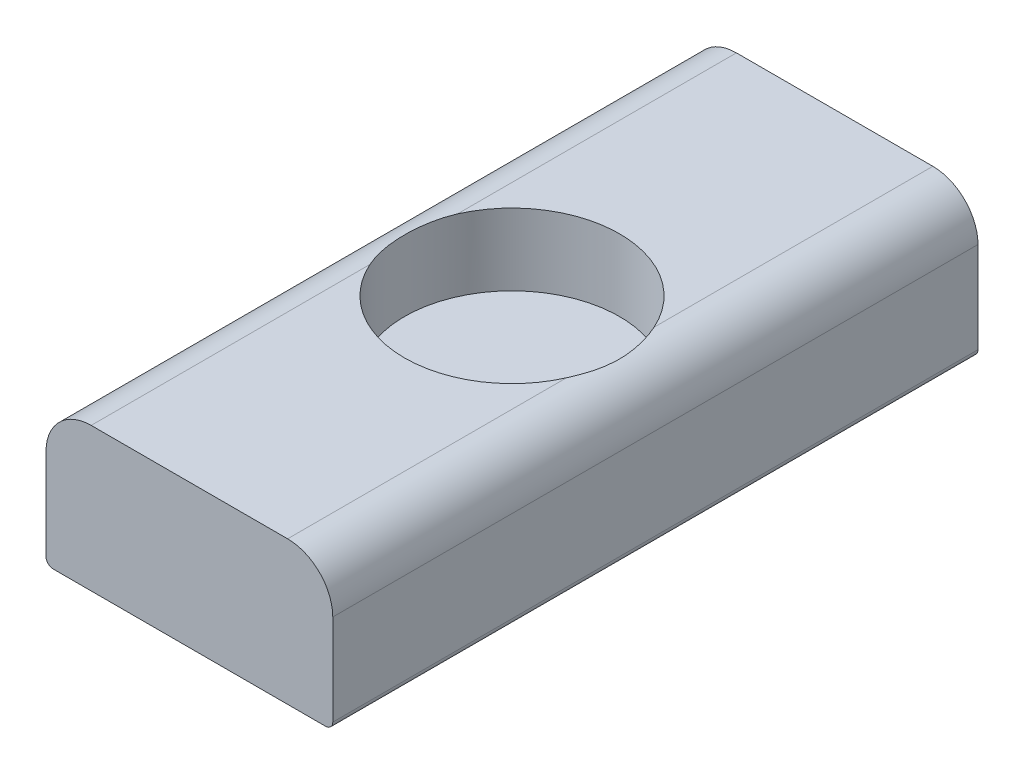
ISO-10303-21;
HEADER;
FILE_DESCRIPTION(('STEP AP214'),'2;1');
FILE_NAME('part.step','',(''),(''),'','','');
FILE_SCHEMA(('AUTOMOTIVE_DESIGN { 1 0 10303 214 1 1 1 1 }'));
ENDSEC;
DATA;
#1=APPLICATION_CONTEXT('core data for automotive mechanical design processes');
#2=APPLICATION_PROTOCOL_DEFINITION('international standard','automotive_design',2000,#1);
#3=PRODUCT_CONTEXT('',#1,'mechanical');
#4=PRODUCT('Part','Part','',(#3));
#5=PRODUCT_RELATED_PRODUCT_CATEGORY('part','',(#4));
#6=PRODUCT_DEFINITION_FORMATION('','',#4);
#7=PRODUCT_DEFINITION_CONTEXT('part definition',#1,'design');
#8=PRODUCT_DEFINITION('design','',#6,#7);
#9=PRODUCT_DEFINITION_SHAPE('','',#8);
#10=(LENGTH_UNIT() NAMED_UNIT(*) SI_UNIT(.MILLI.,.METRE.));
#11=(NAMED_UNIT(*) PLANE_ANGLE_UNIT() SI_UNIT($,.RADIAN.));
#12=(NAMED_UNIT(*) SI_UNIT($,.STERADIAN.) SOLID_ANGLE_UNIT());
#13=UNCERTAINTY_MEASURE_WITH_UNIT(LENGTH_MEASURE(1.E-05),#10,'distance_accuracy_value','');
#14=(GEOMETRIC_REPRESENTATION_CONTEXT(3) GLOBAL_UNCERTAINTY_ASSIGNED_CONTEXT((#13)) GLOBAL_UNIT_ASSIGNED_CONTEXT((#10,
#11,#12)) REPRESENTATION_CONTEXT('',''));
#15=CARTESIAN_POINT('',(0.,0.,0.));
#16=DIRECTION('',(0.,0.,1.));
#17=DIRECTION('',(1.,0.,0.));
#18=AXIS2_PLACEMENT_3D('',#15,#16,#17);
#19=CARTESIAN_POINT('',(-20.,10.,90.));
#20=DIRECTION('',(0.,-1.,0.));
#21=DIRECTION('',(0.,0.,-1.));
#22=AXIS2_PLACEMENT_3D('',#19,#20,#21);
#23=PLANE('',#22);
#24=DIRECTION('',(-1.,0.,0.));
#25=VECTOR('',#24,1.);
#26=CARTESIAN_POINT('',(-20.,10.,90.));
#27=LINE('',#26,#25);
#28=CARTESIAN_POINT('',(13.7,10.,90.));
#29=VERTEX_POINT('',#28);
#30=CARTESIAN_POINT('',(-13.7,10.,90.));
#31=VERTEX_POINT('',#30);
#32=EDGE_CURVE('E143',#29,#31,#27,.T.);
#33=ORIENTED_EDGE('',*,*,#32,.F.);
#34=DIRECTION('',(0.,0.,-1.));
#35=VECTOR('',#34,1.);
#36=CARTESIAN_POINT('',(13.7,10.,90.));
#37=LINE('',#36,#35);
#38=CARTESIAN_POINT('',(13.7,10.,51.1081912216302));
#39=VERTEX_POINT('',#38);
#40=EDGE_CURVE('E165',#29,#39,#37,.T.);
#41=ORIENTED_EDGE('',*,*,#40,.T.);
#42=CARTESIAN_POINT('',(0.,10.,45.));
#43=DIRECTION('',(0.,1.,0.));
#44=DIRECTION('',(0.,0.,1.));
#45=AXIS2_PLACEMENT_3D('',#42,#43,#44);
#46=CIRCLE('',#45,15.);
#47=CARTESIAN_POINT('',(-13.7,10.,51.1081912216302));
#48=VERTEX_POINT('',#47);
#49=EDGE_CURVE('E253',#48,#39,#46,.T.);
#50=ORIENTED_EDGE('',*,*,#49,.F.);
#51=DIRECTION('',(0.,0.,-1.));
#52=VECTOR('',#51,1.);
#53=CARTESIAN_POINT('',(-13.7,10.,90.));
#54=LINE('',#53,#52);
#55=EDGE_CURVE('E159',#48,#31,#54,.F.);
#56=ORIENTED_EDGE('',*,*,#55,.T.);
#57=EDGE_LOOP('',(#33,#41,#50,#56));
#58=FACE_BOUND('',#57,.T.);
#59=ADVANCED_FACE('F33',(#58),#23,.F.);
#60=CARTESIAN_POINT('',(20.,-10.,90.));
#61=DIRECTION('',(-1.,0.,0.));
#62=DIRECTION('',(0.,0.,1.));
#63=AXIS2_PLACEMENT_3D('',#60,#61,#62);
#64=PLANE('',#63);
#65=DIRECTION('',(0.,1.,0.));
#66=VECTOR('',#65,1.);
#67=CARTESIAN_POINT('',(20.,-10.,0.));
#68=LINE('',#67,#66);
#69=CARTESIAN_POINT('',(20.,-9.,0.));
#70=VERTEX_POINT('',#69);
#71=CARTESIAN_POINT('',(20.,3.7,0.));
#72=VERTEX_POINT('',#71);
#73=EDGE_CURVE('E248',#70,#72,#68,.T.);
#74=ORIENTED_EDGE('',*,*,#73,.T.);
#75=DIRECTION('',(0.,0.,-1.));
#76=VECTOR('',#75,1.);
#77=CARTESIAN_POINT('',(20.,3.7,90.));
#78=LINE('',#77,#76);
#79=CARTESIAN_POINT('',(20.,3.7,90.));
#80=VERTEX_POINT('',#79);
#81=EDGE_CURVE('E57',#72,#80,#78,.F.);
#82=ORIENTED_EDGE('',*,*,#81,.T.);
#83=DIRECTION('',(0.,1.,0.));
#84=VECTOR('',#83,1.);
#85=CARTESIAN_POINT('',(20.,-10.,90.));
#86=LINE('',#85,#84);
#87=CARTESIAN_POINT('',(20.,-9.,90.));
#88=VERTEX_POINT('',#87);
#89=EDGE_CURVE('E140',#88,#80,#86,.T.);
#90=ORIENTED_EDGE('',*,*,#89,.F.);
#91=DIRECTION('',(0.,0.,-1.));
#92=VECTOR('',#91,1.);
#93=CARTESIAN_POINT('',(20.,-9.,90.));
#94=LINE('',#93,#92);
#95=EDGE_CURVE('E156',#88,#70,#94,.T.);
#96=ORIENTED_EDGE('',*,*,#95,.T.);
#97=EDGE_LOOP('',(#74,#82,#90,#96));
#98=FACE_BOUND('',#97,.T.);
#99=ADVANCED_FACE('F202',(#98),#64,.F.);
#100=CARTESIAN_POINT('',(13.7,10.,38.8918087783698));
#101=VERTEX_POINT('',#100);
#102=CARTESIAN_POINT('',(-13.7,10.,38.8918087783698));
#103=VERTEX_POINT('',#102);
#104=EDGE_CURVE('E254',#101,#103,#46,.T.);
#105=ORIENTED_EDGE('',*,*,#104,.F.);
#106=DIRECTION('',(0.,0.,-1.));
#107=VECTOR('',#106,1.);
#108=CARTESIAN_POINT('',(13.7,10.,90.));
#109=LINE('',#108,#107);
#110=CARTESIAN_POINT('',(13.7,10.,0.));
#111=VERTEX_POINT('',#110);
#112=EDGE_CURVE('E163',#101,#111,#109,.T.);
#113=ORIENTED_EDGE('',*,*,#112,.T.);
#114=DIRECTION('',(-1.,0.,0.));
#115=VECTOR('',#114,1.);
#116=CARTESIAN_POINT('',(-20.,10.,0.));
#117=LINE('',#116,#115);
#118=CARTESIAN_POINT('',(-13.7,10.,0.));
#119=VERTEX_POINT('',#118);
#120=EDGE_CURVE('E145',#111,#119,#117,.T.);
#121=ORIENTED_EDGE('',*,*,#120,.T.);
#122=DIRECTION('',(0.,0.,-1.));
#123=VECTOR('',#122,1.);
#124=CARTESIAN_POINT('',(-13.7,10.,90.));
#125=LINE('',#124,#123);
#126=EDGE_CURVE('E161',#119,#103,#125,.F.);
#127=ORIENTED_EDGE('',*,*,#126,.T.);
#128=EDGE_LOOP('',(#105,#113,#121,#127));
#129=FACE_BOUND('',#128,.T.);
#130=ADVANCED_FACE('F198',(#129),#23,.F.);
#131=CARTESIAN_POINT('',(-20.,-10.,90.));
#132=DIRECTION('',(1.,0.,0.));
#133=DIRECTION('',(0.,0.,-1.));
#134=AXIS2_PLACEMENT_3D('',#131,#132,#133);
#135=PLANE('',#134);
#136=DIRECTION('',(0.,-1.,0.));
#137=VECTOR('',#136,1.);
#138=CARTESIAN_POINT('',(-20.,-10.,90.));
#139=LINE('',#138,#137);
#140=CARTESIAN_POINT('',(-20.,3.7,90.));
#141=VERTEX_POINT('',#140);
#142=CARTESIAN_POINT('',(-20.,-9.,90.));
#143=VERTEX_POINT('',#142);
#144=EDGE_CURVE('E230',#141,#143,#139,.T.);
#145=ORIENTED_EDGE('',*,*,#144,.F.);
#146=DIRECTION('',(0.,0.,-1.));
#147=VECTOR('',#146,1.);
#148=CARTESIAN_POINT('',(-20.,3.7,90.));
#149=LINE('',#148,#147);
#150=CARTESIAN_POINT('',(-20.,3.7,0.));
#151=VERTEX_POINT('',#150);
#152=EDGE_CURVE('E11',#141,#151,#149,.T.);
#153=ORIENTED_EDGE('',*,*,#152,.T.);
#154=DIRECTION('',(0.,-1.,0.));
#155=VECTOR('',#154,1.);
#156=CARTESIAN_POINT('',(-20.,-10.,0.));
#157=LINE('',#156,#155);
#158=CARTESIAN_POINT('',(-20.,-9.,0.));
#159=VERTEX_POINT('',#158);
#160=EDGE_CURVE('E141',#151,#159,#157,.T.);
#161=ORIENTED_EDGE('',*,*,#160,.T.);
#162=DIRECTION('',(0.,0.,-1.));
#163=VECTOR('',#162,1.);
#164=CARTESIAN_POINT('',(-20.,-9.,90.));
#165=LINE('',#164,#163);
#166=EDGE_CURVE('E121',#159,#143,#165,.F.);
#167=ORIENTED_EDGE('',*,*,#166,.T.);
#168=EDGE_LOOP('',(#145,#153,#161,#167));
#169=FACE_BOUND('',#168,.T.);
#170=ADVANCED_FACE('F195',(#169),#135,.F.);
#171=CARTESIAN_POINT('',(-20.,-10.,90.));
#172=DIRECTION('',(0.,1.,0.));
#173=DIRECTION('',(0.,0.,1.));
#174=AXIS2_PLACEMENT_3D('',#171,#172,#173);
#175=PLANE('',#174);
#176=DIRECTION('',(1.,0.,0.));
#177=VECTOR('',#176,1.);
#178=CARTESIAN_POINT('',(-20.,-10.,90.));
#179=LINE('',#178,#177);
#180=CARTESIAN_POINT('',(-19.,-10.,90.));
#181=VERTEX_POINT('',#180);
#182=CARTESIAN_POINT('',(19.,-10.,90.));
#183=VERTEX_POINT('',#182);
#184=EDGE_CURVE('E134',#181,#183,#179,.T.);
#185=ORIENTED_EDGE('',*,*,#184,.F.);
#186=DIRECTION('',(0.,0.,-1.));
#187=VECTOR('',#186,1.);
#188=CARTESIAN_POINT('',(-19.,-10.,90.));
#189=LINE('',#188,#187);
#190=CARTESIAN_POINT('',(-19.,-10.,0.));
#191=VERTEX_POINT('',#190);
#192=EDGE_CURVE('E119',#181,#191,#189,.T.);
#193=ORIENTED_EDGE('',*,*,#192,.T.);
#194=DIRECTION('',(1.,0.,0.));
#195=VECTOR('',#194,1.);
#196=CARTESIAN_POINT('',(-20.,-10.,0.));
#197=LINE('',#196,#195);
#198=CARTESIAN_POINT('',(19.,-10.,0.));
#199=VERTEX_POINT('',#198);
#200=EDGE_CURVE('E131',#191,#199,#197,.T.);
#201=ORIENTED_EDGE('',*,*,#200,.T.);
#202=DIRECTION('',(0.,0.,-1.));
#203=VECTOR('',#202,1.);
#204=CARTESIAN_POINT('',(19.,-10.,90.));
#205=LINE('',#204,#203);
#206=EDGE_CURVE('E135',#199,#183,#205,.F.);
#207=ORIENTED_EDGE('',*,*,#206,.T.);
#208=EDGE_LOOP('',(#185,#193,#201,#207));
#209=FACE_BOUND('',#208,.T.);
#210=ADVANCED_FACE('F130',(#209),#175,.F.);
#211=CARTESIAN_POINT('',(0.,0.,90.));
#212=DIRECTION('',(0.,0.,-1.));
#213=DIRECTION('',(-1.,0.,0.));
#214=AXIS2_PLACEMENT_3D('',#211,#212,#213);
#215=PLANE('',#214);
#216=ORIENTED_EDGE('',*,*,#89,.T.);
#217=CARTESIAN_POINT('',(13.7,3.7,90.));
#218=DIRECTION('',(0.,0.,-1.));
#219=DIRECTION('',(-1.,0.,0.));
#220=AXIS2_PLACEMENT_3D('',#217,#218,#219);
#221=CIRCLE('',#220,6.3);
#222=EDGE_CURVE('E42',#80,#29,#221,.F.);
#223=ORIENTED_EDGE('',*,*,#222,.T.);
#224=ORIENTED_EDGE('',*,*,#32,.T.);
#225=CARTESIAN_POINT('',(-13.7,3.7,90.));
#226=DIRECTION('',(0.,0.,-1.));
#227=DIRECTION('',(-1.,0.,0.));
#228=AXIS2_PLACEMENT_3D('',#225,#226,#227);
#229=CIRCLE('',#228,6.3);
#230=EDGE_CURVE('E49',#31,#141,#229,.F.);
#231=ORIENTED_EDGE('',*,*,#230,.T.);
#232=ORIENTED_EDGE('',*,*,#144,.T.);
#233=CARTESIAN_POINT('',(-19.,-9.,90.));
#234=DIRECTION('',(0.,0.,-1.));
#235=DIRECTION('',(-1.,0.,0.));
#236=AXIS2_PLACEMENT_3D('',#233,#234,#235);
#237=CIRCLE('',#236,1.);
#238=EDGE_CURVE('E154',#143,#181,#237,.F.);
#239=ORIENTED_EDGE('',*,*,#238,.T.);
#240=ORIENTED_EDGE('',*,*,#184,.T.);
#241=CARTESIAN_POINT('',(19.,-9.,90.));
#242=DIRECTION('',(0.,0.,-1.));
#243=DIRECTION('',(-1.,0.,0.));
#244=AXIS2_PLACEMENT_3D('',#241,#242,#243);
#245=CIRCLE('',#244,1.);
#246=EDGE_CURVE('E152',#183,#88,#245,.F.);
#247=ORIENTED_EDGE('',*,*,#246,.T.);
#248=EDGE_LOOP('',(#216,#223,#224,#231,#232,#239,#240,#247));
#249=FACE_BOUND('',#248,.T.);
#250=ADVANCED_FACE('F187',(#249),#215,.F.);
#251=CARTESIAN_POINT('',(0.,0.,0.));
#252=DIRECTION('',(0.,0.,-1.));
#253=DIRECTION('',(-1.,0.,0.));
#254=AXIS2_PLACEMENT_3D('',#251,#252,#253);
#255=PLANE('',#254);
#256=ORIENTED_EDGE('',*,*,#120,.F.);
#257=CARTESIAN_POINT('',(13.7,3.7,0.));
#258=DIRECTION('',(0.,0.,-1.));
#259=DIRECTION('',(-1.,0.,0.));
#260=AXIS2_PLACEMENT_3D('',#257,#258,#259);
#261=CIRCLE('',#260,6.3);
#262=EDGE_CURVE('E238',#111,#72,#261,.T.);
#263=ORIENTED_EDGE('',*,*,#262,.T.);
#264=ORIENTED_EDGE('',*,*,#73,.F.);
#265=CARTESIAN_POINT('',(19.,-9.,0.));
#266=DIRECTION('',(0.,0.,-1.));
#267=DIRECTION('',(-1.,0.,0.));
#268=AXIS2_PLACEMENT_3D('',#265,#266,#267);
#269=CIRCLE('',#268,1.);
#270=EDGE_CURVE('E125',#70,#199,#269,.T.);
#271=ORIENTED_EDGE('',*,*,#270,.T.);
#272=ORIENTED_EDGE('',*,*,#200,.F.);
#273=CARTESIAN_POINT('',(-19.,-9.,0.));
#274=DIRECTION('',(0.,0.,-1.));
#275=DIRECTION('',(-1.,0.,0.));
#276=AXIS2_PLACEMENT_3D('',#273,#274,#275);
#277=CIRCLE('',#276,1.);
#278=EDGE_CURVE('E115',#191,#159,#277,.T.);
#279=ORIENTED_EDGE('',*,*,#278,.T.);
#280=ORIENTED_EDGE('',*,*,#160,.F.);
#281=CARTESIAN_POINT('',(-13.7,3.7,0.));
#282=DIRECTION('',(0.,0.,-1.));
#283=DIRECTION('',(-1.,0.,0.));
#284=AXIS2_PLACEMENT_3D('',#281,#282,#283);
#285=CIRCLE('',#284,6.3);
#286=EDGE_CURVE('E237',#151,#119,#285,.T.);
#287=ORIENTED_EDGE('',*,*,#286,.T.);
#288=EDGE_LOOP('',(#256,#263,#264,#271,#272,#279,#280,#287));
#289=FACE_BOUND('',#288,.T.);
#290=ADVANCED_FACE('F138',(#289),#255,.T.);
#291=CARTESIAN_POINT('',(-19.,-9.,90.));
#292=DIRECTION('',(0.,0.,-1.));
#293=DIRECTION('',(-1.,0.,0.));
#294=AXIS2_PLACEMENT_3D('',#291,#292,#293);
#295=CYLINDRICAL_SURFACE('',#294,1.);
#296=ORIENTED_EDGE('',*,*,#238,.F.);
#297=ORIENTED_EDGE('',*,*,#166,.F.);
#298=ORIENTED_EDGE('',*,*,#278,.F.);
#299=ORIENTED_EDGE('',*,*,#192,.F.);
#300=EDGE_LOOP('',(#296,#297,#298,#299));
#301=FACE_BOUND('',#300,.T.);
#302=ADVANCED_FACE('F118',(#301),#295,.T.);
#303=CARTESIAN_POINT('',(19.,-9.,90.));
#304=DIRECTION('',(0.,0.,-1.));
#305=DIRECTION('',(-1.,0.,0.));
#306=AXIS2_PLACEMENT_3D('',#303,#304,#305);
#307=CYLINDRICAL_SURFACE('',#306,1.);
#308=ORIENTED_EDGE('',*,*,#246,.F.);
#309=ORIENTED_EDGE('',*,*,#206,.F.);
#310=ORIENTED_EDGE('',*,*,#270,.F.);
#311=ORIENTED_EDGE('',*,*,#95,.F.);
#312=EDGE_LOOP('',(#308,#309,#310,#311));
#313=FACE_BOUND('',#312,.T.);
#314=ADVANCED_FACE('F185',(#313),#307,.T.);
#315=CARTESIAN_POINT('',(0.,0.,45.));
#316=DIRECTION('',(0.,1.,0.));
#317=DIRECTION('',(0.,0.,1.));
#318=AXIS2_PLACEMENT_3D('',#315,#316,#317);
#319=CYLINDRICAL_SURFACE('',#318,15.);
#320=CARTESIAN_POINT('',(0.,0.,45.));
#321=DIRECTION('',(0.,1.,0.));
#322=DIRECTION('',(0.,0.,1.));
#323=AXIS2_PLACEMENT_3D('',#320,#321,#322);
#324=CIRCLE('',#323,15.);
#325=CARTESIAN_POINT('',(0.,0.,60.));
#326=VERTEX_POINT('',#325);
#327=EDGE_CURVE('E249',#326,#326,#324,.T.);
#328=ORIENTED_EDGE('',*,*,#327,.F.);
#329=EDGE_LOOP('',(#328));
#330=FACE_BOUND('',#329,.T.);
#331=ORIENTED_EDGE('',*,*,#49,.T.);
#332=CARTESIAN_POINT('',(13.7,10.,51.1081912216302));
#333=CARTESIAN_POINT('',(13.7847164742446,9.999986254881,50.9181882150864));
#334=CARTESIAN_POINT('',(13.8654695112353,9.99829108454482,50.7264335724219));
#335=CARTESIAN_POINT('',(14.0189150468975,9.99239482185464,50.3397806771782));
#336=CARTESIAN_POINT('',(14.0916082274063,9.98819394166757,50.1448826921159));
#337=CARTESIAN_POINT('',(14.2288116255542,9.97814312587346,49.7522794946897));
#338=CARTESIAN_POINT('',(14.2933222185522,9.97229326594956,49.5545744115584));
#339=CARTESIAN_POINT('',(14.4140613694388,9.95969572837255,49.1566899933687));
#340=CARTESIAN_POINT('',(14.4702897494847,9.95294803144623,48.9565106052798));
#341=CARTESIAN_POINT('',(14.6263395968246,9.93241522484479,48.353014508985));
#342=CARTESIAN_POINT('',(14.7136472440317,9.91832901233353,47.9463921002969));
#343=CARTESIAN_POINT('',(14.8542067159439,9.8937783514055,47.127266559506));
#344=CARTESIAN_POINT('',(14.9074605926953,9.88331368477544,46.71476378328));
#345=CARTESIAN_POINT('',(14.979889114798,9.8687344041473,45.8826085171154));
#346=CARTESIAN_POINT('',(14.9987286859982,9.86468227602207,45.4629254751579));
#347=CARTESIAN_POINT('',(15.0011470697855,9.86417193114407,44.6234147976015));
#348=CARTESIAN_POINT('',(14.9847221821404,9.86771451128944,44.203587151451));
#349=CARTESIAN_POINT('',(14.9167810787926,9.88147499501181,43.3674000858326));
#350=CARTESIAN_POINT('',(14.8653067077297,9.89168493800821,42.9510371292876));
#351=CARTESIAN_POINT('',(14.7277363100315,9.91599664964724,42.1243507096024));
#352=CARTESIAN_POINT('',(14.6416510723255,9.93009720507546,41.7140254056793));
#353=CARTESIAN_POINT('',(14.4334426421817,9.95805979600414,40.8941556536044));
#354=CARTESIAN_POINT('',(14.3106605769538,9.97191208535659,40.4847767932915));
#355=CARTESIAN_POINT('',(14.1007331626843,9.98763003065047,39.8799584152735));
#356=CARTESIAN_POINT('',(14.0265199621441,9.99202474923558,39.6800173204733));
#357=CARTESIAN_POINT('',(13.869598237247,9.99820426832909,39.2833804213096));
#358=CARTESIAN_POINT('',(13.786886865286,9.99998819092816,39.086685730558));
#359=CARTESIAN_POINT('',(13.7,10.,38.8918087783698));
#360=B_SPLINE_CURVE_WITH_KNOTS('',3,(#332,#333,#334,#335,#336,#337,#338,#339,#340,#341,#342,
#343,#344,#345,#346,#347,#348,#349,#350,#351,#352,#353,#354,#355,#356,#357,#358,#359),
.UNSPECIFIED.,.F.,.F.,(4,2,2,2,2,2,2,2,2,2,2,2,2,4),(0.,0.624028440031794,1.24800404896195,
1.87195102397509,2.49591139495681,3.74272990642789,4.98947327877903,6.24829212848915,
7.50724307010819,8.76469361315491,10.0217524861561,11.3028961445009,11.9426602663762,
12.5826394666982),.UNSPECIFIED.);
#361=EDGE_CURVE('E174',#39,#101,#360,.T.);
#362=ORIENTED_EDGE('',*,*,#361,.T.);
#363=ORIENTED_EDGE('',*,*,#104,.T.);
#364=CARTESIAN_POINT('',(-13.7,10.,38.8918087783698));
#365=CARTESIAN_POINT('',(-13.7847164742446,9.999986254881,39.0818117849136));
#366=CARTESIAN_POINT('',(-13.8654695112353,9.99829108454482,39.2735664275781));
#367=CARTESIAN_POINT('',(-14.0189150468975,9.99239482185464,39.6602193228218));
#368=CARTESIAN_POINT('',(-14.0916082274063,9.98819394166757,39.8551173078841));
#369=CARTESIAN_POINT('',(-14.2288116255542,9.97814312587346,40.2477205053103));
#370=CARTESIAN_POINT('',(-14.2933222185522,9.97229326594956,40.4454255884416));
#371=CARTESIAN_POINT('',(-14.4140613694388,9.95969572837255,40.8433100066313));
#372=CARTESIAN_POINT('',(-14.4702897494847,9.95294803144623,41.0434893947202));
#373=CARTESIAN_POINT('',(-14.6263395968246,9.93241522484479,41.646985491015));
#374=CARTESIAN_POINT('',(-14.7136472440317,9.91832901233353,42.0536078997031));
#375=CARTESIAN_POINT('',(-14.8542067159439,9.89377835140551,42.872733440494));
#376=CARTESIAN_POINT('',(-14.9074605926953,9.88331368477544,43.28523621672));
#377=CARTESIAN_POINT('',(-14.979889114798,9.8687344041473,44.1173914828846));
#378=CARTESIAN_POINT('',(-14.9987286859982,9.86468227602207,44.5370745248421));
#379=CARTESIAN_POINT('',(-15.0011470697855,9.86417193114407,45.3765852023985));
#380=CARTESIAN_POINT('',(-14.9847221821404,9.86771451128944,45.796412848549));
#381=CARTESIAN_POINT('',(-14.9167810787926,9.88147499501181,46.6325999141674));
#382=CARTESIAN_POINT('',(-14.8653067077297,9.89168493800821,47.0489628707124));
#383=CARTESIAN_POINT('',(-14.7277363100315,9.91599664964724,47.8756492903976));
#384=CARTESIAN_POINT('',(-14.6416510723255,9.93009720507546,48.2859745943207));
#385=CARTESIAN_POINT('',(-14.4334426421817,9.95805979600414,49.1058443463956));
#386=CARTESIAN_POINT('',(-14.3106605769538,9.97191208535658,49.5152232067085));
#387=CARTESIAN_POINT('',(-14.1007331626843,9.98763003065047,50.1200415847265));
#388=CARTESIAN_POINT('',(-14.0265199621441,9.99202474923558,50.3199826795267));
#389=CARTESIAN_POINT('',(-13.869598237247,9.99820426832909,50.7166195786904));
#390=CARTESIAN_POINT('',(-13.786886865286,9.99998819092816,50.913314269442));
#391=CARTESIAN_POINT('',(-13.7,10.,51.1081912216302));
#392=B_SPLINE_CURVE_WITH_KNOTS('',3,(#364,#365,#366,#367,#368,#369,#370,#371,#372,#373,#374,
#375,#376,#377,#378,#379,#380,#381,#382,#383,#384,#385,#386,#387,#388,#389,#390,#391),
.UNSPECIFIED.,.F.,.F.,(4,2,2,2,2,2,2,2,2,2,2,2,2,4),(0.,0.624028440031787,1.24800404896193,
1.87195102397507,2.4959113949568,3.74272990642787,4.98947327877902,6.24829212848914,
7.50724307010819,8.76469361315491,10.0217524861561,11.3028961445008,11.9426602663761,
12.5826394666982),.UNSPECIFIED.);
#393=EDGE_CURVE('E168',#103,#48,#392,.T.);
#394=ORIENTED_EDGE('',*,*,#393,.T.);
#395=EDGE_LOOP('',(#331,#362,#363,#394));
#396=FACE_BOUND('',#395,.T.);
#397=ADVANCED_FACE('F179',(#330,#396),#319,.F.);
#398=CARTESIAN_POINT('',(0.,0.,45.));
#399=DIRECTION('',(0.,1.,0.));
#400=DIRECTION('',(0.,0.,1.));
#401=AXIS2_PLACEMENT_3D('',#398,#399,#400);
#402=PLANE('',#401);
#403=ORIENTED_EDGE('',*,*,#327,.T.);
#404=EDGE_LOOP('',(#403));
#405=FACE_BOUND('',#404,.T.);
#406=ADVANCED_FACE('F184',(#405),#402,.T.);
#407=CARTESIAN_POINT('',(13.7,3.7,90.));
#408=DIRECTION('',(0.,0.,-1.));
#409=DIRECTION('',(-1.,0.,0.));
#410=AXIS2_PLACEMENT_3D('',#407,#408,#409);
#411=CYLINDRICAL_SURFACE('',#410,6.3);
#412=ORIENTED_EDGE('',*,*,#222,.F.);
#413=ORIENTED_EDGE('',*,*,#81,.F.);
#414=ORIENTED_EDGE('',*,*,#262,.F.);
#415=ORIENTED_EDGE('',*,*,#112,.F.);
#416=ORIENTED_EDGE('',*,*,#361,.F.);
#417=ORIENTED_EDGE('',*,*,#40,.F.);
#418=EDGE_LOOP('',(#412,#413,#414,#415,#416,#417));
#419=FACE_BOUND('',#418,.T.);
#420=ADVANCED_FACE('F210',(#419),#411,.T.);
#421=CARTESIAN_POINT('',(-13.7,3.7,90.));
#422=DIRECTION('',(0.,0.,-1.));
#423=DIRECTION('',(-1.,0.,0.));
#424=AXIS2_PLACEMENT_3D('',#421,#422,#423);
#425=CYLINDRICAL_SURFACE('',#424,6.3);
#426=ORIENTED_EDGE('',*,*,#393,.F.);
#427=ORIENTED_EDGE('',*,*,#126,.F.);
#428=ORIENTED_EDGE('',*,*,#286,.F.);
#429=ORIENTED_EDGE('',*,*,#152,.F.);
#430=ORIENTED_EDGE('',*,*,#230,.F.);
#431=ORIENTED_EDGE('',*,*,#55,.F.);
#432=EDGE_LOOP('',(#426,#427,#428,#429,#430,#431));
#433=FACE_BOUND('',#432,.T.);
#434=ADVANCED_FACE('F35',(#433),#425,.T.);
#435=CLOSED_SHELL('',(#59,#99,#130,#170,#210,#250,#290,#302,#314,#397,#406,#420,#434));
#436=MANIFOLD_SOLID_BREP('B2',#435);
#437=ADVANCED_BREP_SHAPE_REPRESENTATION('',(#18,#436),#14);
#438=SHAPE_DEFINITION_REPRESENTATION(#9,#437);
ENDSEC;
END-ISO-10303-21;
